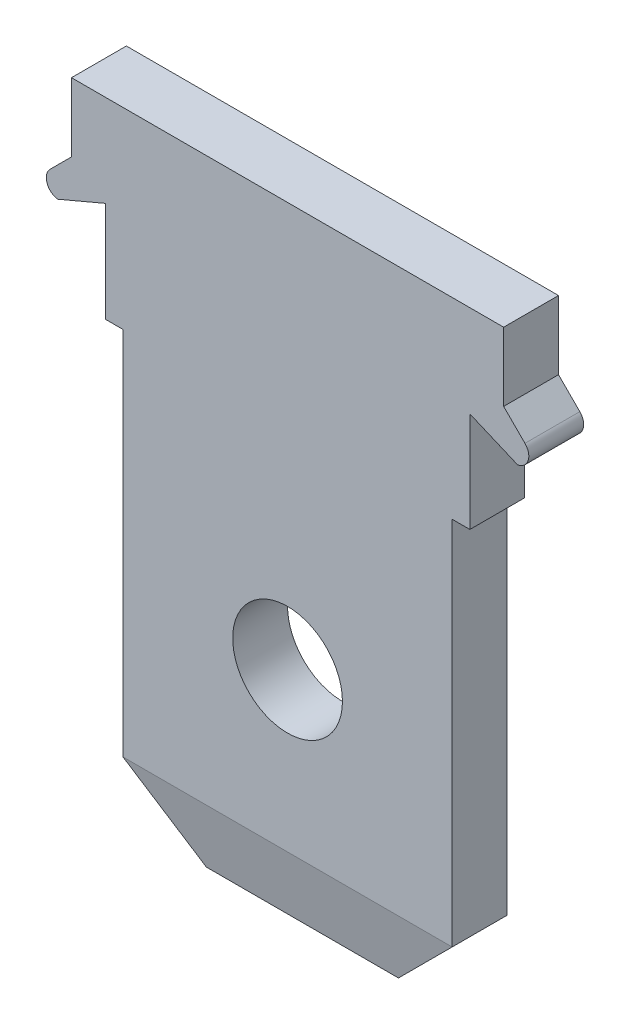
ISO-10303-21;
HEADER;
FILE_DESCRIPTION(('STEP AP214'),'2;1');
FILE_NAME('part.step','',(''),(''),'','','');
FILE_SCHEMA(('AUTOMOTIVE_DESIGN { 1 0 10303 214 1 1 1 1 }'));
ENDSEC;
DATA;
#1=APPLICATION_CONTEXT('core data for automotive mechanical design processes');
#2=APPLICATION_PROTOCOL_DEFINITION('international standard','automotive_design',2000,#1);
#3=PRODUCT_CONTEXT('',#1,'mechanical');
#4=PRODUCT('Part','Part','',(#3));
#5=PRODUCT_RELATED_PRODUCT_CATEGORY('part','',(#4));
#6=PRODUCT_DEFINITION_FORMATION('','',#4);
#7=PRODUCT_DEFINITION_CONTEXT('part definition',#1,'design');
#8=PRODUCT_DEFINITION('design','',#6,#7);
#9=PRODUCT_DEFINITION_SHAPE('','',#8);
#10=(LENGTH_UNIT() NAMED_UNIT(*) SI_UNIT(.MILLI.,.METRE.));
#11=(NAMED_UNIT(*) PLANE_ANGLE_UNIT() SI_UNIT($,.RADIAN.));
#12=(NAMED_UNIT(*) SI_UNIT($,.STERADIAN.) SOLID_ANGLE_UNIT());
#13=UNCERTAINTY_MEASURE_WITH_UNIT(LENGTH_MEASURE(1.E-05),#10,'distance_accuracy_value','');
#14=(GEOMETRIC_REPRESENTATION_CONTEXT(3) GLOBAL_UNCERTAINTY_ASSIGNED_CONTEXT((#13)) GLOBAL_UNIT_ASSIGNED_CONTEXT((#10,
#11,#12)) REPRESENTATION_CONTEXT('',''));
#15=CARTESIAN_POINT('',(0.,0.,0.));
#16=DIRECTION('',(0.,0.,1.));
#17=DIRECTION('',(1.,0.,0.));
#18=AXIS2_PLACEMENT_3D('',#15,#16,#17);
#19=CARTESIAN_POINT('',(0.,-1.96601761683978,0.4));
#20=DIRECTION('',(0.,0.211868439989799,-0.977298196118405));
#21=DIRECTION('',(0.,0.977298196118405,0.211868439989799));
#22=AXIS2_PLACEMENT_3D('',#19,#20,#21);
#23=PLANE('',#22);
#24=DIRECTION('',(1.,0.,0.));
#25=VECTOR('',#24,1.);
#26=CARTESIAN_POINT('',(1.4,-2.96601761683978,0.183210036781719));
#27=LINE('',#26,#25);
#28=CARTESIAN_POINT('',(1.4,-2.96601761683978,0.183210036781719));
#29=VERTEX_POINT('',#28);
#30=CARTESIAN_POINT('',(-1.4,-2.96601761683978,0.183210036781719));
#31=VERTEX_POINT('',#30);
#32=EDGE_CURVE('E224',#29,#31,#27,.F.);
#33=ORIENTED_EDGE('',*,*,#32,.F.);
#34=DIRECTION('',(-0.6989422644594,-0.698942264459399,-0.151523667803855));
#35=VECTOR('',#34,1.);
#36=CARTESIAN_POINT('',(2.4,-1.96601761683978,0.4));
#37=LINE('',#36,#35);
#38=CARTESIAN_POINT('',(2.4,-1.96601761683978,0.4));
#39=VERTEX_POINT('',#38);
#40=EDGE_CURVE('E215',#39,#29,#37,.T.);
#41=ORIENTED_EDGE('',*,*,#40,.F.);
#42=DIRECTION('',(1.,0.,0.));
#43=VECTOR('',#42,1.);
#44=CARTESIAN_POINT('',(-2.5818610682E-05,-1.96601761683978,0.4));
#45=LINE('',#44,#43);
#46=CARTESIAN_POINT('',(-2.4,-1.96601761683978,0.4));
#47=VERTEX_POINT('',#46);
#48=EDGE_CURVE('E214',#47,#39,#45,.T.);
#49=ORIENTED_EDGE('',*,*,#48,.F.);
#50=DIRECTION('',(-0.698942264459397,0.698942264459402,0.151523667803855));
#51=VECTOR('',#50,1.);
#52=CARTESIAN_POINT('',(-1.4,-2.96601761683978,0.183210036781719));
#53=LINE('',#52,#51);
#54=EDGE_CURVE('E241',#31,#47,#53,.T.);
#55=ORIENTED_EDGE('',*,*,#54,.F.);
#56=EDGE_LOOP('',(#33,#41,#49,#55));
#57=FACE_BOUND('',#56,.T.);
#58=ADVANCED_FACE('F15',(#57),#23,.F.);
#59=CARTESIAN_POINT('',(-1.4,-2.96601761683978,0.));
#60=DIRECTION('',(-0.70710678118655,-0.707106781186545,0.));
#61=DIRECTION('',(0.707106781186545,-0.70710678118655,0.));
#62=AXIS2_PLACEMENT_3D('',#59,#60,#61);
#63=PLANE('',#62);
#64=DIRECTION('',(0.698942264459397,-0.698942264459402,0.151523667803854));
#65=VECTOR('',#64,1.);
#66=CARTESIAN_POINT('',(-2.4,-1.96601761683978,-0.399999999999999));
#67=LINE('',#66,#65);
#68=CARTESIAN_POINT('',(-2.4,-1.96601761683978,-0.4));
#69=VERTEX_POINT('',#68);
#70=CARTESIAN_POINT('',(-1.4,-2.96601761683978,-0.183210036781719));
#71=VERTEX_POINT('',#70);
#72=EDGE_CURVE('E33',#69,#71,#67,.T.);
#73=ORIENTED_EDGE('',*,*,#72,.T.);
#74=DIRECTION('',(0.,0.,-1.));
#75=VECTOR('',#74,1.);
#76=CARTESIAN_POINT('',(-1.4,-2.96601761683978,0.));
#77=LINE('',#76,#75);
#78=EDGE_CURVE('E222',#31,#71,#77,.T.);
#79=ORIENTED_EDGE('',*,*,#78,.F.);
#80=ORIENTED_EDGE('',*,*,#54,.T.);
#81=DIRECTION('',(0.,0.,1.));
#82=VECTOR('',#81,1.);
#83=CARTESIAN_POINT('',(-2.4,-1.96601761683978,0.));
#84=LINE('',#83,#82);
#85=EDGE_CURVE('E228',#69,#47,#84,.T.);
#86=ORIENTED_EDGE('',*,*,#85,.F.);
#87=EDGE_LOOP('',(#73,#79,#80,#86));
#88=FACE_BOUND('',#87,.T.);
#89=ADVANCED_FACE('F600',(#88),#63,.T.);
#90=CARTESIAN_POINT('',(1.4,-2.96601761683978,0.));
#91=DIRECTION('',(0.,-1.,0.));
#92=DIRECTION('',(0.,0.,-1.));
#93=AXIS2_PLACEMENT_3D('',#90,#91,#92);
#94=PLANE('',#93);
#95=DIRECTION('',(1.,0.,0.));
#96=VECTOR('',#95,1.);
#97=CARTESIAN_POINT('',(0.,-2.96601761683978,-0.183210036781719));
#98=LINE('',#97,#96);
#99=CARTESIAN_POINT('',(1.4,-2.96601761683978,-0.183210036781719));
#100=VERTEX_POINT('',#99);
#101=EDGE_CURVE('E205',#71,#100,#98,.T.);
#102=ORIENTED_EDGE('',*,*,#101,.T.);
#103=DIRECTION('',(0.,0.,1.));
#104=VECTOR('',#103,1.);
#105=CARTESIAN_POINT('',(1.4,-2.96601761683978,0.));
#106=LINE('',#105,#104);
#107=EDGE_CURVE('E212',#29,#100,#106,.F.);
#108=ORIENTED_EDGE('',*,*,#107,.F.);
#109=ORIENTED_EDGE('',*,*,#32,.T.);
#110=ORIENTED_EDGE('',*,*,#78,.T.);
#111=EDGE_LOOP('',(#102,#108,#109,#110));
#112=FACE_BOUND('',#111,.T.);
#113=ADVANCED_FACE('F591',(#112),#94,.T.);
#114=CARTESIAN_POINT('',(2.4,-1.96601761683978,0.));
#115=DIRECTION('',(0.707106781186547,-0.707106781186548,0.));
#116=DIRECTION('',(0.707106781186548,0.707106781186547,0.));
#117=AXIS2_PLACEMENT_3D('',#114,#115,#116);
#118=PLANE('',#117);
#119=DIRECTION('',(0.698942264459401,0.698942264459399,-0.151523667803853));
#120=VECTOR('',#119,1.);
#121=CARTESIAN_POINT('',(1.4,-2.96601761683978,-0.183210036781719));
#122=LINE('',#121,#120);
#123=CARTESIAN_POINT('',(2.4,-1.96601761683978,-0.4));
#124=VERTEX_POINT('',#123);
#125=EDGE_CURVE('E202',#100,#124,#122,.T.);
#126=ORIENTED_EDGE('',*,*,#125,.T.);
#127=DIRECTION('',(0.,0.,-1.));
#128=VECTOR('',#127,1.);
#129=CARTESIAN_POINT('',(2.4,-1.96601761683978,0.));
#130=LINE('',#129,#128);
#131=EDGE_CURVE('E197',#39,#124,#130,.T.);
#132=ORIENTED_EDGE('',*,*,#131,.F.);
#133=ORIENTED_EDGE('',*,*,#40,.T.);
#134=ORIENTED_EDGE('',*,*,#107,.T.);
#135=EDGE_LOOP('',(#126,#132,#133,#134));
#136=FACE_BOUND('',#135,.T.);
#137=ADVANCED_FACE('F582',(#136),#118,.T.);
#138=CARTESIAN_POINT('',(-2.5818610682E-05,2.32358335182788,0.4));
#139=DIRECTION('',(0.,0.,1.));
#140=DIRECTION('',(1.,0.,0.));
#141=AXIS2_PLACEMENT_3D('',#138,#139,#140);
#142=PLANE('',#141);
#143=CARTESIAN_POINT('',(0.,0.333982383160217,0.4));
#144=DIRECTION('',(0.,0.,1.));
#145=DIRECTION('',(1.,0.,0.));
#146=AXIS2_PLACEMENT_3D('',#143,#144,#145);
#147=CIRCLE('',#146,0.8);
#148=CARTESIAN_POINT('',(0.8,0.333982383160217,0.4));
#149=VERTEX_POINT('',#148);
#150=EDGE_CURVE('E194',#149,#149,#147,.F.);
#151=ORIENTED_EDGE('',*,*,#150,.T.);
#152=EDGE_LOOP('',(#151));
#153=FACE_BOUND('',#152,.T.);
#154=DIRECTION('',(1.,0.,0.));
#155=VECTOR('',#154,1.);
#156=CARTESIAN_POINT('',(-2.40000000000001,3.43083559104691,0.4));
#157=LINE('',#156,#155);
#158=CARTESIAN_POINT('',(-2.4,3.43083559104691,0.4));
#159=VERTEX_POINT('',#158);
#160=CARTESIAN_POINT('',(-2.65761621096519,3.43083559104691,0.4));
#161=VERTEX_POINT('',#160);
#162=EDGE_CURVE('E253',#159,#161,#157,.F.);
#163=ORIENTED_EDGE('',*,*,#162,.F.);
#164=DIRECTION('',(0.,1.,0.));
#165=VECTOR('',#164,1.);
#166=CARTESIAN_POINT('',(-2.4,-1.96601761683978,0.4));
#167=LINE('',#166,#165);
#168=EDGE_CURVE('E245',#47,#159,#167,.T.);
#169=ORIENTED_EDGE('',*,*,#168,.F.);
#170=ORIENTED_EDGE('',*,*,#48,.T.);
#171=DIRECTION('',(0.,1.,0.));
#172=VECTOR('',#171,1.);
#173=CARTESIAN_POINT('',(2.4,3.43398238316022,0.4));
#174=LINE('',#173,#172);
#175=CARTESIAN_POINT('',(2.4,3.43398238316022,0.4));
#176=VERTEX_POINT('',#175);
#177=EDGE_CURVE('E199',#176,#39,#174,.F.);
#178=ORIENTED_EDGE('',*,*,#177,.F.);
#179=DIRECTION('',(1.,0.,0.));
#180=VECTOR('',#179,1.);
#181=CARTESIAN_POINT('',(2.65761621096519,3.43398238316022,0.4));
#182=LINE('',#181,#180);
#183=CARTESIAN_POINT('',(2.65761621096519,3.43398238316022,0.4));
#184=VERTEX_POINT('',#183);
#185=EDGE_CURVE('E189',#184,#176,#182,.F.);
#186=ORIENTED_EDGE('',*,*,#185,.F.);
#187=DIRECTION('',(0.,1.,0.));
#188=VECTOR('',#187,1.);
#189=CARTESIAN_POINT('',(2.65761621096519,4.8933899181275,0.4));
#190=LINE('',#189,#188);
#191=CARTESIAN_POINT('',(2.65761621096519,4.8933899181275,0.4));
#192=VERTEX_POINT('',#191);
#193=EDGE_CURVE('E156',#192,#184,#190,.F.);
#194=ORIENTED_EDGE('',*,*,#193,.F.);
#195=DIRECTION('',(0.920495772451847,-0.390752521294845,0.));
#196=VECTOR('',#195,1.);
#197=CARTESIAN_POINT('',(3.35223318871512,4.5985234521284,0.4));
#198=LINE('',#197,#196);
#199=CARTESIAN_POINT('',(3.35223318871512,4.59852345212839,0.4));
#200=VERTEX_POINT('',#199);
#201=EDGE_CURVE('E152',#200,#192,#198,.F.);
#202=ORIENTED_EDGE('',*,*,#201,.F.);
#203=CARTESIAN_POINT('',(3.32546731281112,4.78795600457028,0.4));
#204=DIRECTION('',(0.,0.,1.));
#205=DIRECTION('',(1.,0.,0.));
#206=AXIS2_PLACEMENT_3D('',#203,#204,#205);
#207=CIRCLE('',#206,0.191314150123703);
#208=CARTESIAN_POINT('',(3.46074684570053,4.92323553745969,0.4));
#209=VERTEX_POINT('',#208);
#210=EDGE_CURVE('E18',#209,#200,#207,.F.);
#211=ORIENTED_EDGE('',*,*,#210,.F.);
#212=DIRECTION('',(-0.707106781186551,0.707106781186544,0.));
#213=VECTOR('',#212,1.);
#214=CARTESIAN_POINT('',(3.15,5.23398238316022,0.4));
#215=LINE('',#214,#213);
#216=CARTESIAN_POINT('',(3.15,5.23398238316022,0.4));
#217=VERTEX_POINT('',#216);
#218=EDGE_CURVE('E137',#217,#209,#215,.F.);
#219=ORIENTED_EDGE('',*,*,#218,.F.);
#220=DIRECTION('',(0.,1.,0.));
#221=VECTOR('',#220,1.);
#222=CARTESIAN_POINT('',(3.15,6.23398238316022,0.4));
#223=LINE('',#222,#221);
#224=CARTESIAN_POINT('',(3.15,6.23398238316022,0.4));
#225=VERTEX_POINT('',#224);
#226=EDGE_CURVE('E291',#225,#217,#223,.F.);
#227=ORIENTED_EDGE('',*,*,#226,.F.);
#228=DIRECTION('',(1.,0.,0.));
#229=VECTOR('',#228,1.);
#230=CARTESIAN_POINT('',(0.,6.23398238316022,0.4));
#231=LINE('',#230,#229);
#232=CARTESIAN_POINT('',(-3.15,6.23398238316022,0.4));
#233=VERTEX_POINT('',#232);
#234=EDGE_CURVE('E286',#233,#225,#231,.T.);
#235=ORIENTED_EDGE('',*,*,#234,.F.);
#236=DIRECTION('',(0.,1.,0.));
#237=VECTOR('',#236,1.);
#238=CARTESIAN_POINT('',(-3.15,5.23398238316022,0.4));
#239=LINE('',#238,#237);
#240=CARTESIAN_POINT('',(-3.15,5.23398238316022,0.4));
#241=VERTEX_POINT('',#240);
#242=EDGE_CURVE('E281',#241,#233,#239,.T.);
#243=ORIENTED_EDGE('',*,*,#242,.F.);
#244=DIRECTION('',(-0.707106781186545,-0.70710678118655,0.));
#245=VECTOR('',#244,1.);
#246=CARTESIAN_POINT('',(-3.46074684570053,4.92323553745968,0.4));
#247=LINE('',#246,#245);
#248=CARTESIAN_POINT('',(-3.46074684570053,4.92323553745968,0.4));
#249=VERTEX_POINT('',#248);
#250=EDGE_CURVE('E275',#249,#241,#247,.F.);
#251=ORIENTED_EDGE('',*,*,#250,.F.);
#252=CARTESIAN_POINT('',(-3.32546731281112,4.78795600457027,0.4));
#253=DIRECTION('',(0.,0.,1.));
#254=DIRECTION('',(1.,0.,0.));
#255=AXIS2_PLACEMENT_3D('',#252,#253,#254);
#256=CIRCLE('',#255,0.191314150123703);
#257=CARTESIAN_POINT('',(-3.35223318871512,4.59852345212839,0.4));
#258=VERTEX_POINT('',#257);
#259=EDGE_CURVE('E324',#258,#249,#256,.F.);
#260=ORIENTED_EDGE('',*,*,#259,.F.);
#261=DIRECTION('',(0.920495772451846,0.390752521294847,0.));
#262=VECTOR('',#261,1.);
#263=CARTESIAN_POINT('',(-2.65761621096519,4.8933899181275,0.4));
#264=LINE('',#263,#262);
#265=CARTESIAN_POINT('',(-2.65761621096519,4.8933899181275,0.4));
#266=VERTEX_POINT('',#265);
#267=EDGE_CURVE('E270',#266,#258,#264,.F.);
#268=ORIENTED_EDGE('',*,*,#267,.F.);
#269=DIRECTION('',(0.,1.,0.));
#270=VECTOR('',#269,1.);
#271=CARTESIAN_POINT('',(-2.65761621096519,3.43083559104691,0.4));
#272=LINE('',#271,#270);
#273=EDGE_CURVE('E261',#161,#266,#272,.T.);
#274=ORIENTED_EDGE('',*,*,#273,.F.);
#275=EDGE_LOOP('',(#163,#169,#170,#178,#186,#194,#202,#211,#219,#227,#235,#243,#251,#260,#268,#274));
#276=FACE_BOUND('',#275,.T.);
#277=ADVANCED_FACE('F154',(#153,#276),#142,.T.);
#278=CARTESIAN_POINT('',(2.4,3.43398238316022,0.));
#279=DIRECTION('',(1.,0.,0.));
#280=DIRECTION('',(0.,0.,-1.));
#281=AXIS2_PLACEMENT_3D('',#278,#279,#280);
#282=PLANE('',#281);
#283=DIRECTION('',(0.,1.,0.));
#284=VECTOR('',#283,1.);
#285=CARTESIAN_POINT('',(2.4,2.32358335182788,-0.4));
#286=LINE('',#285,#284);
#287=CARTESIAN_POINT('',(2.4,3.43398238316022,-0.4));
#288=VERTEX_POINT('',#287);
#289=EDGE_CURVE('E184',#124,#288,#286,.T.);
#290=ORIENTED_EDGE('',*,*,#289,.T.);
#291=DIRECTION('',(0.,0.,-1.));
#292=VECTOR('',#291,1.);
#293=CARTESIAN_POINT('',(2.4,3.43398238316022,0.));
#294=LINE('',#293,#292);
#295=EDGE_CURVE('E187',#176,#288,#294,.T.);
#296=ORIENTED_EDGE('',*,*,#295,.F.);
#297=ORIENTED_EDGE('',*,*,#177,.T.);
#298=ORIENTED_EDGE('',*,*,#131,.T.);
#299=EDGE_LOOP('',(#290,#296,#297,#298));
#300=FACE_BOUND('',#299,.T.);
#301=ADVANCED_FACE('F565',(#300),#282,.T.);
#302=CARTESIAN_POINT('',(2.65761621096519,3.43398238316022,0.));
#303=DIRECTION('',(0.,-1.,0.));
#304=DIRECTION('',(0.,0.,-1.));
#305=AXIS2_PLACEMENT_3D('',#302,#303,#304);
#306=PLANE('',#305);
#307=DIRECTION('',(1.,0.,0.));
#308=VECTOR('',#307,1.);
#309=CARTESIAN_POINT('',(-2.5818610682E-05,3.43398238316022,-0.4));
#310=LINE('',#309,#308);
#311=CARTESIAN_POINT('',(2.65761621096519,3.43398238316022,-0.4));
#312=VERTEX_POINT('',#311);
#313=EDGE_CURVE('E176',#288,#312,#310,.T.);
#314=ORIENTED_EDGE('',*,*,#313,.T.);
#315=DIRECTION('',(0.,0.,-1.));
#316=VECTOR('',#315,1.);
#317=CARTESIAN_POINT('',(2.65761621096519,3.43398238316022,0.));
#318=LINE('',#317,#316);
#319=EDGE_CURVE('E159',#184,#312,#318,.T.);
#320=ORIENTED_EDGE('',*,*,#319,.F.);
#321=ORIENTED_EDGE('',*,*,#185,.T.);
#322=ORIENTED_EDGE('',*,*,#295,.T.);
#323=EDGE_LOOP('',(#314,#320,#321,#322));
#324=FACE_BOUND('',#323,.T.);
#325=ADVANCED_FACE('F556',(#324),#306,.T.);
#326=CARTESIAN_POINT('',(2.65761621096519,4.8933899181275,0.));
#327=DIRECTION('',(1.,0.,0.));
#328=DIRECTION('',(0.,0.,-1.));
#329=AXIS2_PLACEMENT_3D('',#326,#327,#328);
#330=PLANE('',#329);
#331=DIRECTION('',(0.,1.,0.));
#332=VECTOR('',#331,1.);
#333=CARTESIAN_POINT('',(2.65761621096519,2.32358335182788,-0.4));
#334=LINE('',#333,#332);
#335=CARTESIAN_POINT('',(2.65761621096519,4.8933899181275,-0.4));
#336=VERTEX_POINT('',#335);
#337=EDGE_CURVE('E173',#312,#336,#334,.T.);
#338=ORIENTED_EDGE('',*,*,#337,.T.);
#339=DIRECTION('',(0.,0.,1.));
#340=VECTOR('',#339,1.);
#341=CARTESIAN_POINT('',(2.65761621096519,4.8933899181275,0.));
#342=LINE('',#341,#340);
#343=EDGE_CURVE('E150',#192,#336,#342,.F.);
#344=ORIENTED_EDGE('',*,*,#343,.F.);
#345=ORIENTED_EDGE('',*,*,#193,.T.);
#346=ORIENTED_EDGE('',*,*,#319,.T.);
#347=EDGE_LOOP('',(#338,#344,#345,#346));
#348=FACE_BOUND('',#347,.T.);
#349=ADVANCED_FACE('F548',(#348),#330,.T.);
#350=CARTESIAN_POINT('',(3.35223318871512,4.5985234521284,0.));
#351=DIRECTION('',(-0.390752521294845,-0.920495772451847,0.));
#352=DIRECTION('',(0.920495772451847,-0.390752521294845,0.));
#353=AXIS2_PLACEMENT_3D('',#350,#351,#352);
#354=PLANE('',#353);
#355=DIRECTION('',(0.920495772451847,-0.390752521294844,0.));
#356=VECTOR('',#355,1.);
#357=CARTESIAN_POINT('',(2.65761621096519,4.8933899181275,-0.4));
#358=LINE('',#357,#356);
#359=CARTESIAN_POINT('',(3.35223318871512,4.59852345212839,-0.4));
#360=VERTEX_POINT('',#359);
#361=EDGE_CURVE('E164',#336,#360,#358,.T.);
#362=ORIENTED_EDGE('',*,*,#361,.T.);
#363=DIRECTION('',(0.,0.,1.));
#364=VECTOR('',#363,1.);
#365=CARTESIAN_POINT('',(3.35223318871512,4.59852345212839,0.));
#366=LINE('',#365,#364);
#367=EDGE_CURVE('E146',#200,#360,#366,.F.);
#368=ORIENTED_EDGE('',*,*,#367,.F.);
#369=ORIENTED_EDGE('',*,*,#201,.T.);
#370=ORIENTED_EDGE('',*,*,#343,.T.);
#371=EDGE_LOOP('',(#362,#368,#369,#370));
#372=FACE_BOUND('',#371,.T.);
#373=ADVANCED_FACE('F162',(#372),#354,.T.);
#374=CARTESIAN_POINT('',(3.32546731281112,4.78795600457028,0.));
#375=DIRECTION('',(0.,0.,1.));
#376=DIRECTION('',(1.,0.,0.));
#377=AXIS2_PLACEMENT_3D('',#374,#375,#376);
#378=CYLINDRICAL_SURFACE('',#377,0.191314150123703);
#379=CARTESIAN_POINT('',(3.32546731281112,4.78795600457028,-0.4));
#380=DIRECTION('',(0.,0.,1.));
#381=DIRECTION('',(1.,0.,0.));
#382=AXIS2_PLACEMENT_3D('',#379,#380,#381);
#383=CIRCLE('',#382,0.191314150123703);
#384=CARTESIAN_POINT('',(3.46074684570053,4.92323553745969,-0.4));
#385=VERTEX_POINT('',#384);
#386=EDGE_CURVE('E320',#360,#385,#383,.T.);
#387=ORIENTED_EDGE('',*,*,#386,.T.);
#388=DIRECTION('',(0.,0.,1.));
#389=VECTOR('',#388,1.);
#390=CARTESIAN_POINT('',(3.46074684570053,4.92323553745969,0.));
#391=LINE('',#390,#389);
#392=EDGE_CURVE('E148',#209,#385,#391,.F.);
#393=ORIENTED_EDGE('',*,*,#392,.F.);
#394=ORIENTED_EDGE('',*,*,#210,.T.);
#395=ORIENTED_EDGE('',*,*,#367,.T.);
#396=EDGE_LOOP('',(#387,#393,#394,#395));
#397=FACE_BOUND('',#396,.T.);
#398=ADVANCED_FACE('F144',(#397),#378,.T.);
#399=CARTESIAN_POINT('',(3.15,5.23398238316022,0.));
#400=DIRECTION('',(0.707106781186544,0.707106781186551,0.));
#401=DIRECTION('',(-0.707106781186551,0.707106781186544,0.));
#402=AXIS2_PLACEMENT_3D('',#399,#400,#401);
#403=PLANE('',#402);
#404=DIRECTION('',(-0.707106781186551,0.707106781186544,0.));
#405=VECTOR('',#404,1.);
#406=CARTESIAN_POINT('',(3.46074684570053,4.92323553745969,-0.4));
#407=LINE('',#406,#405);
#408=CARTESIAN_POINT('',(3.15,5.23398238316022,-0.4));
#409=VERTEX_POINT('',#408);
#410=EDGE_CURVE('E322',#385,#409,#407,.T.);
#411=ORIENTED_EDGE('',*,*,#410,.T.);
#412=DIRECTION('',(0.,0.,-1.));
#413=VECTOR('',#412,1.);
#414=CARTESIAN_POINT('',(3.15,5.23398238316022,0.));
#415=LINE('',#414,#413);
#416=EDGE_CURVE('E288',#217,#409,#415,.T.);
#417=ORIENTED_EDGE('',*,*,#416,.F.);
#418=ORIENTED_EDGE('',*,*,#218,.T.);
#419=ORIENTED_EDGE('',*,*,#392,.T.);
#420=EDGE_LOOP('',(#411,#417,#418,#419));
#421=FACE_BOUND('',#420,.T.);
#422=ADVANCED_FACE('F373',(#421),#403,.T.);
#423=CARTESIAN_POINT('',(3.15,6.23398238316022,0.));
#424=DIRECTION('',(1.,0.,0.));
#425=DIRECTION('',(0.,0.,-1.));
#426=AXIS2_PLACEMENT_3D('',#423,#424,#425);
#427=PLANE('',#426);
#428=DIRECTION('',(0.,1.,0.));
#429=VECTOR('',#428,1.);
#430=CARTESIAN_POINT('',(3.15,2.32358335182788,-0.4));
#431=LINE('',#430,#429);
#432=CARTESIAN_POINT('',(3.15,6.23398238316022,-0.4));
#433=VERTEX_POINT('',#432);
#434=EDGE_CURVE('E350',#409,#433,#431,.T.);
#435=ORIENTED_EDGE('',*,*,#434,.T.);
#436=DIRECTION('',(0.,0.,1.));
#437=VECTOR('',#436,1.);
#438=CARTESIAN_POINT('',(3.15,6.23398238316022,0.));
#439=LINE('',#438,#437);
#440=EDGE_CURVE('E283',#225,#433,#439,.F.);
#441=ORIENTED_EDGE('',*,*,#440,.F.);
#442=ORIENTED_EDGE('',*,*,#226,.T.);
#443=ORIENTED_EDGE('',*,*,#416,.T.);
#444=EDGE_LOOP('',(#435,#441,#442,#443));
#445=FACE_BOUND('',#444,.T.);
#446=ADVANCED_FACE('F363',(#445),#427,.T.);
#447=CARTESIAN_POINT('',(0.,6.23398238316022,0.));
#448=DIRECTION('',(0.,1.,0.));
#449=DIRECTION('',(0.,0.,1.));
#450=AXIS2_PLACEMENT_3D('',#447,#448,#449);
#451=PLANE('',#450);
#452=DIRECTION('',(1.,0.,0.));
#453=VECTOR('',#452,1.);
#454=CARTESIAN_POINT('',(-2.5818610682E-05,6.23398238316022,-0.4));
#455=LINE('',#454,#453);
#456=CARTESIAN_POINT('',(-3.15,6.23398238316022,-0.4));
#457=VERTEX_POINT('',#456);
#458=EDGE_CURVE('E342',#433,#457,#455,.F.);
#459=ORIENTED_EDGE('',*,*,#458,.T.);
#460=DIRECTION('',(0.,0.,1.));
#461=VECTOR('',#460,1.);
#462=CARTESIAN_POINT('',(-3.15,6.23398238316022,0.));
#463=LINE('',#462,#461);
#464=EDGE_CURVE('E278',#233,#457,#463,.F.);
#465=ORIENTED_EDGE('',*,*,#464,.F.);
#466=ORIENTED_EDGE('',*,*,#234,.T.);
#467=ORIENTED_EDGE('',*,*,#440,.T.);
#468=EDGE_LOOP('',(#459,#465,#466,#467));
#469=FACE_BOUND('',#468,.T.);
#470=ADVANCED_FACE('F417',(#469),#451,.T.);
#471=CARTESIAN_POINT('',(-3.15,5.23398238316022,0.));
#472=DIRECTION('',(-1.,0.,0.));
#473=DIRECTION('',(0.,0.,1.));
#474=AXIS2_PLACEMENT_3D('',#471,#472,#473);
#475=PLANE('',#474);
#476=DIRECTION('',(0.,1.,0.));
#477=VECTOR('',#476,1.);
#478=CARTESIAN_POINT('',(-3.15,2.32358335182788,-0.4));
#479=LINE('',#478,#477);
#480=CARTESIAN_POINT('',(-3.15,5.23398238316022,-0.4));
#481=VERTEX_POINT('',#480);
#482=EDGE_CURVE('E339',#457,#481,#479,.F.);
#483=ORIENTED_EDGE('',*,*,#482,.T.);
#484=DIRECTION('',(0.,0.,1.));
#485=VECTOR('',#484,1.);
#486=CARTESIAN_POINT('',(-3.15,5.23398238316022,0.));
#487=LINE('',#486,#485);
#488=EDGE_CURVE('E277',#241,#481,#487,.F.);
#489=ORIENTED_EDGE('',*,*,#488,.F.);
#490=ORIENTED_EDGE('',*,*,#242,.T.);
#491=ORIENTED_EDGE('',*,*,#464,.T.);
#492=EDGE_LOOP('',(#483,#489,#490,#491));
#493=FACE_BOUND('',#492,.T.);
#494=ADVANCED_FACE('F412',(#493),#475,.T.);
#495=CARTESIAN_POINT('',(-3.46074684570053,4.92323553745968,0.));
#496=DIRECTION('',(-0.70710678118655,0.707106781186545,0.));
#497=DIRECTION('',(-0.707106781186545,-0.70710678118655,0.));
#498=AXIS2_PLACEMENT_3D('',#495,#496,#497);
#499=PLANE('',#498);
#500=DIRECTION('',(-0.707106781186545,-0.707106781186549,0.));
#501=VECTOR('',#500,1.);
#502=CARTESIAN_POINT('',(-3.15,5.23398238316022,-0.4));
#503=LINE('',#502,#501);
#504=CARTESIAN_POINT('',(-3.46074684570053,4.92323553745968,-0.4));
#505=VERTEX_POINT('',#504);
#506=EDGE_CURVE('E319',#481,#505,#503,.T.);
#507=ORIENTED_EDGE('',*,*,#506,.T.);
#508=DIRECTION('',(0.,0.,1.));
#509=VECTOR('',#508,1.);
#510=CARTESIAN_POINT('',(-3.46074684570053,4.92323553745968,0.));
#511=LINE('',#510,#509);
#512=EDGE_CURVE('E272',#249,#505,#511,.F.);
#513=ORIENTED_EDGE('',*,*,#512,.F.);
#514=ORIENTED_EDGE('',*,*,#250,.T.);
#515=ORIENTED_EDGE('',*,*,#488,.T.);
#516=EDGE_LOOP('',(#507,#513,#514,#515));
#517=FACE_BOUND('',#516,.T.);
#518=ADVANCED_FACE('F410',(#517),#499,.T.);
#519=CARTESIAN_POINT('',(-3.32546731281112,4.78795600457027,0.));
#520=DIRECTION('',(0.,0.,1.));
#521=DIRECTION('',(1.,0.,0.));
#522=AXIS2_PLACEMENT_3D('',#519,#520,#521);
#523=CYLINDRICAL_SURFACE('',#522,0.191314150123703);
#524=CARTESIAN_POINT('',(-3.32546731281112,4.78795600457027,-0.4));
#525=DIRECTION('',(0.,0.,1.));
#526=DIRECTION('',(1.,0.,0.));
#527=AXIS2_PLACEMENT_3D('',#524,#525,#526);
#528=CIRCLE('',#527,0.191314150123703);
#529=CARTESIAN_POINT('',(-3.35223318871512,4.59852345212839,-0.4));
#530=VERTEX_POINT('',#529);
#531=EDGE_CURVE('E315',#505,#530,#528,.T.);
#532=ORIENTED_EDGE('',*,*,#531,.T.);
#533=DIRECTION('',(0.,0.,1.));
#534=VECTOR('',#533,1.);
#535=CARTESIAN_POINT('',(-3.35223318871512,4.59852345212839,0.));
#536=LINE('',#535,#534);
#537=EDGE_CURVE('E263',#258,#530,#536,.F.);
#538=ORIENTED_EDGE('',*,*,#537,.F.);
#539=ORIENTED_EDGE('',*,*,#259,.T.);
#540=ORIENTED_EDGE('',*,*,#512,.T.);
#541=EDGE_LOOP('',(#532,#538,#539,#540));
#542=FACE_BOUND('',#541,.T.);
#543=ADVANCED_FACE('F418',(#542),#523,.T.);
#544=CARTESIAN_POINT('',(-2.65761621096519,4.8933899181275,0.));
#545=DIRECTION('',(0.390752521294847,-0.920495772451846,0.));
#546=DIRECTION('',(0.920495772451846,0.390752521294847,0.));
#547=AXIS2_PLACEMENT_3D('',#544,#545,#546);
#548=PLANE('',#547);
#549=DIRECTION('',(0.920495772451846,0.390752521294846,0.));
#550=VECTOR('',#549,1.);
#551=CARTESIAN_POINT('',(-3.35223318871512,4.59852345212839,-0.4));
#552=LINE('',#551,#550);
#553=CARTESIAN_POINT('',(-2.65761621096519,4.8933899181275,-0.4));
#554=VERTEX_POINT('',#553);
#555=EDGE_CURVE('E318',#530,#554,#552,.T.);
#556=ORIENTED_EDGE('',*,*,#555,.T.);
#557=DIRECTION('',(0.,0.,1.));
#558=VECTOR('',#557,1.);
#559=CARTESIAN_POINT('',(-2.65761621096519,4.8933899181275,0.));
#560=LINE('',#559,#558);
#561=EDGE_CURVE('E255',#266,#554,#560,.F.);
#562=ORIENTED_EDGE('',*,*,#561,.F.);
#563=ORIENTED_EDGE('',*,*,#267,.T.);
#564=ORIENTED_EDGE('',*,*,#537,.T.);
#565=EDGE_LOOP('',(#556,#562,#563,#564));
#566=FACE_BOUND('',#565,.T.);
#567=ADVANCED_FACE('F404',(#566),#548,.T.);
#568=CARTESIAN_POINT('',(-2.65761621096519,3.43083559104691,0.));
#569=DIRECTION('',(-1.,0.,0.));
#570=DIRECTION('',(0.,0.,1.));
#571=AXIS2_PLACEMENT_3D('',#568,#569,#570);
#572=PLANE('',#571);
#573=DIRECTION('',(0.,1.,0.));
#574=VECTOR('',#573,1.);
#575=CARTESIAN_POINT('',(-2.65761621096519,2.32358335182788,-0.4));
#576=LINE('',#575,#574);
#577=CARTESIAN_POINT('',(-2.65761621096519,3.43083559104691,-0.4));
#578=VERTEX_POINT('',#577);
#579=EDGE_CURVE('E385',#554,#578,#576,.F.);
#580=ORIENTED_EDGE('',*,*,#579,.T.);
#581=DIRECTION('',(0.,0.,-1.));
#582=VECTOR('',#581,1.);
#583=CARTESIAN_POINT('',(-2.65761621096519,3.43083559104691,0.));
#584=LINE('',#583,#582);
#585=EDGE_CURVE('E247',#161,#578,#584,.T.);
#586=ORIENTED_EDGE('',*,*,#585,.F.);
#587=ORIENTED_EDGE('',*,*,#273,.T.);
#588=ORIENTED_EDGE('',*,*,#561,.T.);
#589=EDGE_LOOP('',(#580,#586,#587,#588));
#590=FACE_BOUND('',#589,.T.);
#591=ADVANCED_FACE('F394',(#590),#572,.T.);
#592=CARTESIAN_POINT('',(-2.40000000000001,3.43083559104691,0.));
#593=DIRECTION('',(0.,-1.,0.));
#594=DIRECTION('',(0.,0.,-1.));
#595=AXIS2_PLACEMENT_3D('',#592,#593,#594);
#596=PLANE('',#595);
#597=DIRECTION('',(1.,0.,0.));
#598=VECTOR('',#597,1.);
#599=CARTESIAN_POINT('',(-2.5818610682E-05,3.43083559104691,-0.4));
#600=LINE('',#599,#598);
#601=CARTESIAN_POINT('',(-2.40000000000001,3.43083559104691,-0.4));
#602=VERTEX_POINT('',#601);
#603=EDGE_CURVE('E238',#578,#602,#600,.T.);
#604=ORIENTED_EDGE('',*,*,#603,.T.);
#605=DIRECTION('',(0.,0.,1.));
#606=VECTOR('',#605,1.);
#607=CARTESIAN_POINT('',(-2.4,3.43083559104691,0.));
#608=LINE('',#607,#606);
#609=EDGE_CURVE('E233',#159,#602,#608,.F.);
#610=ORIENTED_EDGE('',*,*,#609,.F.);
#611=ORIENTED_EDGE('',*,*,#162,.T.);
#612=ORIENTED_EDGE('',*,*,#585,.T.);
#613=EDGE_LOOP('',(#604,#610,#611,#612));
#614=FACE_BOUND('',#613,.T.);
#615=ADVANCED_FACE('F445',(#614),#596,.T.);
#616=CARTESIAN_POINT('',(-2.4,-1.96601761683978,0.));
#617=DIRECTION('',(-1.,0.,0.));
#618=DIRECTION('',(0.,0.,1.));
#619=AXIS2_PLACEMENT_3D('',#616,#617,#618);
#620=PLANE('',#619);
#621=DIRECTION('',(0.,1.,0.));
#622=VECTOR('',#621,1.);
#623=CARTESIAN_POINT('',(-2.40000000000001,2.32358335182788,-0.4));
#624=LINE('',#623,#622);
#625=EDGE_CURVE('E209',#602,#69,#624,.F.);
#626=ORIENTED_EDGE('',*,*,#625,.T.);
#627=ORIENTED_EDGE('',*,*,#85,.T.);
#628=ORIENTED_EDGE('',*,*,#168,.T.);
#629=ORIENTED_EDGE('',*,*,#609,.T.);
#630=EDGE_LOOP('',(#626,#627,#628,#629));
#631=FACE_BOUND('',#630,.T.);
#632=ADVANCED_FACE('F442',(#631),#620,.T.);
#633=CARTESIAN_POINT('',(0.,-2.96601761683978,-0.183210036781719));
#634=DIRECTION('',(0.,0.211868439989799,0.977298196118405));
#635=DIRECTION('',(0.,-0.977298196118405,0.211868439989799));
#636=AXIS2_PLACEMENT_3D('',#633,#634,#635);
#637=PLANE('',#636);
#638=ORIENTED_EDGE('',*,*,#101,.F.);
#639=ORIENTED_EDGE('',*,*,#72,.F.);
#640=DIRECTION('',(1.,0.,0.));
#641=VECTOR('',#640,1.);
#642=CARTESIAN_POINT('',(-2.5818610682E-05,-1.96601761683978,-0.4));
#643=LINE('',#642,#641);
#644=EDGE_CURVE('E24',#69,#124,#643,.T.);
#645=ORIENTED_EDGE('',*,*,#644,.T.);
#646=ORIENTED_EDGE('',*,*,#125,.F.);
#647=EDGE_LOOP('',(#638,#639,#645,#646));
#648=FACE_BOUND('',#647,.T.);
#649=ADVANCED_FACE('F435',(#648),#637,.F.);
#650=CARTESIAN_POINT('',(0.,0.333982383160217,0.));
#651=DIRECTION('',(0.,0.,1.));
#652=DIRECTION('',(1.,0.,0.));
#653=AXIS2_PLACEMENT_3D('',#650,#651,#652);
#654=CYLINDRICAL_SURFACE('',#653,0.8);
#655=ORIENTED_EDGE('',*,*,#150,.F.);
#656=EDGE_LOOP('',(#655));
#657=FACE_BOUND('',#656,.T.);
#658=CARTESIAN_POINT('',(0.,0.333982383160217,-0.4));
#659=DIRECTION('',(0.,0.,1.));
#660=DIRECTION('',(1.,0.,0.));
#661=AXIS2_PLACEMENT_3D('',#658,#659,#660);
#662=CIRCLE('',#661,0.8);
#663=CARTESIAN_POINT('',(0.8,0.333982383160217,-0.4));
#664=VERTEX_POINT('',#663);
#665=EDGE_CURVE('E10',#664,#664,#662,.F.);
#666=ORIENTED_EDGE('',*,*,#665,.T.);
#667=EDGE_LOOP('',(#666));
#668=FACE_BOUND('',#667,.T.);
#669=ADVANCED_FACE('F429',(#657,#668),#654,.F.);
#670=CARTESIAN_POINT('',(-2.5818610682E-05,2.32358335182788,-0.4));
#671=DIRECTION('',(0.,0.,1.));
#672=DIRECTION('',(1.,0.,0.));
#673=AXIS2_PLACEMENT_3D('',#670,#671,#672);
#674=PLANE('',#673);
#675=ORIENTED_EDGE('',*,*,#665,.F.);
#676=EDGE_LOOP('',(#675));
#677=FACE_BOUND('',#676,.T.);
#678=ORIENTED_EDGE('',*,*,#625,.F.);
#679=ORIENTED_EDGE('',*,*,#603,.F.);
#680=ORIENTED_EDGE('',*,*,#579,.F.);
#681=ORIENTED_EDGE('',*,*,#555,.F.);
#682=ORIENTED_EDGE('',*,*,#531,.F.);
#683=ORIENTED_EDGE('',*,*,#506,.F.);
#684=ORIENTED_EDGE('',*,*,#482,.F.);
#685=ORIENTED_EDGE('',*,*,#458,.F.);
#686=ORIENTED_EDGE('',*,*,#434,.F.);
#687=ORIENTED_EDGE('',*,*,#410,.F.);
#688=ORIENTED_EDGE('',*,*,#386,.F.);
#689=ORIENTED_EDGE('',*,*,#361,.F.);
#690=ORIENTED_EDGE('',*,*,#337,.F.);
#691=ORIENTED_EDGE('',*,*,#313,.F.);
#692=ORIENTED_EDGE('',*,*,#289,.F.);
#693=ORIENTED_EDGE('',*,*,#644,.F.);
#694=EDGE_LOOP('',(#678,#679,#680,#681,#682,#683,#684,#685,#686,#687,#688,#689,#690,#691,#692,#693));
#695=FACE_BOUND('',#694,.T.);
#696=ADVANCED_FACE('F371',(#677,#695),#674,.F.);
#697=CLOSED_SHELL('',(#58,#89,#113,#137,#277,#301,#325,#349,#373,#398,#422,#446,#470,#494,#518,
#543,#567,#591,#615,#632,#649,#669,#696));
#698=MANIFOLD_SOLID_BREP('B1',#697);
#699=ADVANCED_BREP_SHAPE_REPRESENTATION('',(#18,#698),#14);
#700=SHAPE_DEFINITION_REPRESENTATION(#9,#699);
ENDSEC;
END-ISO-10303-21;
